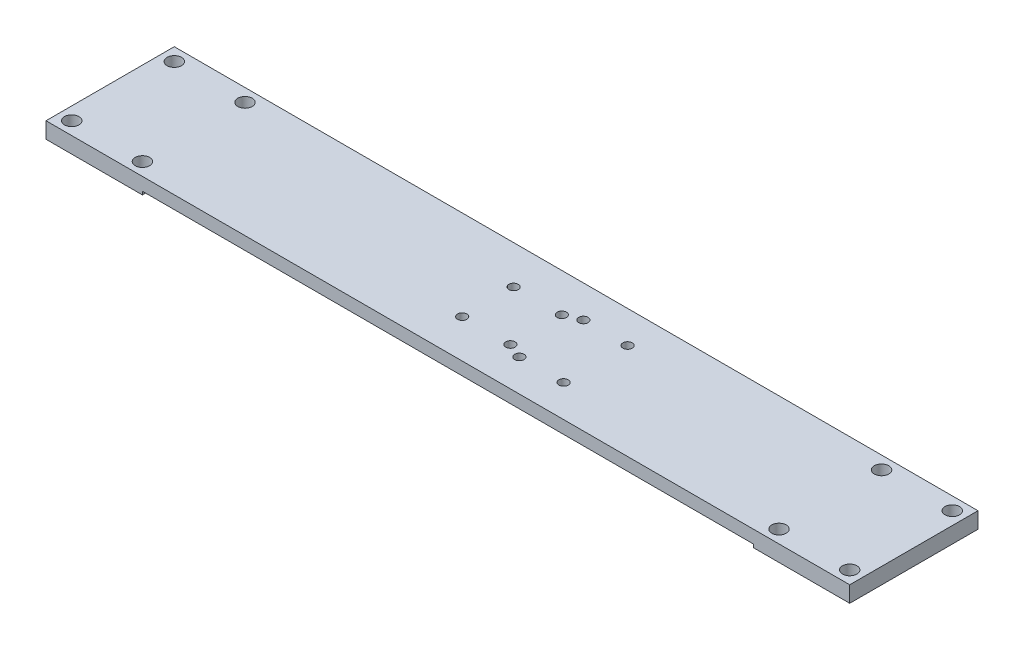
ISO-10303-21;
HEADER;
FILE_DESCRIPTION(('STEP AP214'),'2;1');
FILE_NAME('part.step','',(''),(''),'','','');
FILE_SCHEMA(('AUTOMOTIVE_DESIGN { 1 0 10303 214 1 1 1 1 }'));
ENDSEC;
DATA;
#1=APPLICATION_CONTEXT('core data for automotive mechanical design processes');
#2=APPLICATION_PROTOCOL_DEFINITION('international standard','automotive_design',2000,#1);
#3=PRODUCT_CONTEXT('',#1,'mechanical');
#4=PRODUCT('Part','Part','',(#3));
#5=PRODUCT_RELATED_PRODUCT_CATEGORY('part','',(#4));
#6=PRODUCT_DEFINITION_FORMATION('','',#4);
#7=PRODUCT_DEFINITION_CONTEXT('part definition',#1,'design');
#8=PRODUCT_DEFINITION('design','',#6,#7);
#9=PRODUCT_DEFINITION_SHAPE('','',#8);
#10=(LENGTH_UNIT() NAMED_UNIT(*) SI_UNIT(.MILLI.,.METRE.));
#11=(NAMED_UNIT(*) PLANE_ANGLE_UNIT() SI_UNIT($,.RADIAN.));
#12=(NAMED_UNIT(*) SI_UNIT($,.STERADIAN.) SOLID_ANGLE_UNIT());
#13=UNCERTAINTY_MEASURE_WITH_UNIT(LENGTH_MEASURE(1.E-05),#10,'distance_accuracy_value','');
#14=(GEOMETRIC_REPRESENTATION_CONTEXT(3) GLOBAL_UNCERTAINTY_ASSIGNED_CONTEXT((#13)) GLOBAL_UNIT_ASSIGNED_CONTEXT((#10,
#11,#12)) REPRESENTATION_CONTEXT('',''));
#15=CARTESIAN_POINT('',(0.,0.,0.));
#16=DIRECTION('',(0.,0.,1.));
#17=DIRECTION('',(1.,0.,0.));
#18=AXIS2_PLACEMENT_3D('',#15,#16,#17);
#19=CARTESIAN_POINT('',(0.,0.,0.));
#20=DIRECTION('',(0.,1.,0.));
#21=DIRECTION('',(0.,0.,1.));
#22=AXIS2_PLACEMENT_3D('',#19,#20,#21);
#23=PLANE('',#22);
#24=CARTESIAN_POINT('',(-112.750000000002,3.05311331771918E-13,-29.9000000000004));
#25=DIRECTION('',(0.,-1.,0.));
#26=DIRECTION('',(0.,0.,-1.));
#27=AXIS2_PLACEMENT_3D('',#24,#25,#26);
#28=CIRCLE('',#27,1.45000000000003);
#29=CARTESIAN_POINT('',(-112.750000000002,3.05311331771918E-13,-31.3500000000004));
#30=VERTEX_POINT('',#29);
#31=EDGE_CURVE('E198',#30,#30,#28,.T.);
#32=ORIENTED_EDGE('',*,*,#31,.F.);
#33=EDGE_LOOP('',(#32));
#34=FACE_BOUND('',#33,.T.);
#35=CARTESIAN_POINT('',(-99.0000000000022,3.05311331771918E-13,-10.0000000000008));
#36=DIRECTION('',(0.,-1.,0.));
#37=DIRECTION('',(0.,0.,-1.));
#38=AXIS2_PLACEMENT_3D('',#35,#36,#37);
#39=CIRCLE('',#38,1.45);
#40=CARTESIAN_POINT('',(-99.0000000000022,3.05311331771918E-13,-11.4500000000008));
#41=VERTEX_POINT('',#40);
#42=EDGE_CURVE('E197',#41,#41,#39,.T.);
#43=ORIENTED_EDGE('',*,*,#42,.F.);
#44=EDGE_LOOP('',(#43));
#45=FACE_BOUND('',#44,.T.);
#46=CARTESIAN_POINT('',(-99.0000000000021,3.05311331771918E-13,-29.9000000000003));
#47=DIRECTION('',(0.,-1.,0.));
#48=DIRECTION('',(0.,0.,-1.));
#49=AXIS2_PLACEMENT_3D('',#46,#47,#48);
#50=CIRCLE('',#49,1.45);
#51=CARTESIAN_POINT('',(-99.0000000000021,3.05311331771918E-13,-31.3500000000003));
#52=VERTEX_POINT('',#51);
#53=EDGE_CURVE('E194',#52,#52,#50,.T.);
#54=ORIENTED_EDGE('',*,*,#53,.F.);
#55=EDGE_LOOP('',(#54));
#56=FACE_BOUND('',#55,.T.);
#57=CARTESIAN_POINT('',(-112.750000000002,3.05311331771918E-13,-10.0000000000008));
#58=DIRECTION('',(0.,-1.,0.));
#59=DIRECTION('',(0.,0.,-1.));
#60=AXIS2_PLACEMENT_3D('',#57,#58,#59);
#61=CIRCLE('',#60,1.45);
#62=CARTESIAN_POINT('',(-112.750000000002,3.05311331771918E-13,-11.4500000000008));
#63=VERTEX_POINT('',#62);
#64=EDGE_CURVE('E201',#63,#63,#61,.T.);
#65=ORIENTED_EDGE('',*,*,#64,.F.);
#66=EDGE_LOOP('',(#65));
#67=FACE_BOUND('',#66,.T.);
#68=CARTESIAN_POINT('',(-132.5,0.,-11.95));
#69=DIRECTION('',(0.,1.,0.));
#70=DIRECTION('',(0.,0.,1.));
#71=AXIS2_PLACEMENT_3D('',#68,#69,#70);
#72=CIRCLE('',#71,1.45);
#73=CARTESIAN_POINT('',(-132.5,0.,-10.5));
#74=VERTEX_POINT('',#73);
#75=EDGE_CURVE('E39',#74,#74,#72,.T.);
#76=ORIENTED_EDGE('',*,*,#75,.T.);
#77=EDGE_LOOP('',(#76));
#78=FACE_BOUND('',#77,.T.);
#79=CARTESIAN_POINT('',(-117.5,0.,-11.95));
#80=DIRECTION('',(0.,1.,0.));
#81=DIRECTION('',(0.,0.,1.));
#82=AXIS2_PLACEMENT_3D('',#79,#80,#81);
#83=CIRCLE('',#82,1.45);
#84=CARTESIAN_POINT('',(-117.5,0.,-10.5));
#85=VERTEX_POINT('',#84);
#86=EDGE_CURVE('E246',#85,#85,#83,.T.);
#87=ORIENTED_EDGE('',*,*,#86,.T.);
#88=EDGE_LOOP('',(#87));
#89=FACE_BOUND('',#88,.T.);
#90=CARTESIAN_POINT('',(-117.5,0.,-27.95));
#91=DIRECTION('',(0.,1.,0.));
#92=DIRECTION('',(0.,0.,1.));
#93=AXIS2_PLACEMENT_3D('',#90,#91,#92);
#94=CIRCLE('',#93,1.45);
#95=CARTESIAN_POINT('',(-117.5,0.,-26.5));
#96=VERTEX_POINT('',#95);
#97=EDGE_CURVE('E244',#96,#96,#94,.T.);
#98=ORIENTED_EDGE('',*,*,#97,.T.);
#99=EDGE_LOOP('',(#98));
#100=FACE_BOUND('',#99,.T.);
#101=CARTESIAN_POINT('',(-132.5,0.,-27.95));
#102=DIRECTION('',(0.,1.,0.));
#103=DIRECTION('',(0.,0.,1.));
#104=AXIS2_PLACEMENT_3D('',#101,#102,#103);
#105=CIRCLE('',#104,1.45);
#106=CARTESIAN_POINT('',(-132.5,0.,-26.5));
#107=VERTEX_POINT('',#106);
#108=EDGE_CURVE('E230',#107,#107,#105,.T.);
#109=ORIENTED_EDGE('',*,*,#108,.T.);
#110=EDGE_LOOP('',(#109));
#111=FACE_BOUND('',#110,.T.);
#112=DIRECTION('',(0.,0.,-1.));
#113=VECTOR('',#112,1.);
#114=CARTESIAN_POINT('',(-30.,0.,0.));
#115=LINE('',#114,#113);
#116=CARTESIAN_POINT('',(-30.,0.,0.));
#117=VERTEX_POINT('',#116);
#118=CARTESIAN_POINT('',(-30.,0.,-39.9));
#119=VERTEX_POINT('',#118);
#120=EDGE_CURVE('E127',#117,#119,#115,.T.);
#121=ORIENTED_EDGE('',*,*,#120,.F.);
#122=DIRECTION('',(1.,0.,0.));
#123=VECTOR('',#122,1.);
#124=CARTESIAN_POINT('',(0.,0.,0.));
#125=LINE('',#124,#123);
#126=CARTESIAN_POINT('',(-220.,0.,0.));
#127=VERTEX_POINT('',#126);
#128=EDGE_CURVE('E233',#127,#117,#125,.T.);
#129=ORIENTED_EDGE('',*,*,#128,.F.);
#130=DIRECTION('',(0.,0.,1.));
#131=VECTOR('',#130,1.);
#132=CARTESIAN_POINT('',(-220.,0.,0.));
#133=LINE('',#132,#131);
#134=CARTESIAN_POINT('',(-220.,0.,-39.9));
#135=VERTEX_POINT('',#134);
#136=EDGE_CURVE('E151',#135,#127,#133,.T.);
#137=ORIENTED_EDGE('',*,*,#136,.F.);
#138=DIRECTION('',(-1.,0.,0.));
#139=VECTOR('',#138,1.);
#140=CARTESIAN_POINT('',(0.,0.,-39.9));
#141=LINE('',#140,#139);
#142=EDGE_CURVE('E52',#119,#135,#141,.T.);
#143=ORIENTED_EDGE('',*,*,#142,.F.);
#144=EDGE_LOOP('',(#121,#129,#137,#143));
#145=FACE_BOUND('',#144,.T.);
#146=ADVANCED_FACE('F35',(#34,#45,#56,#67,#78,#89,#100,#111,#145),#23,.F.);
#147=CARTESIAN_POINT('',(0.,4.,0.));
#148=DIRECTION('',(-1.,0.,0.));
#149=DIRECTION('',(0.,0.,1.));
#150=AXIS2_PLACEMENT_3D('',#147,#148,#149);
#151=PLANE('',#150);
#152=DIRECTION('',(0.,-1.,0.));
#153=VECTOR('',#152,1.);
#154=CARTESIAN_POINT('',(0.,4.,0.));
#155=LINE('',#154,#153);
#156=CARTESIAN_POINT('',(0.,4.,0.));
#157=VERTEX_POINT('',#156);
#158=CARTESIAN_POINT('',(0.,-1.,0.));
#159=VERTEX_POINT('',#158);
#160=EDGE_CURVE('E104',#157,#159,#155,.T.);
#161=ORIENTED_EDGE('',*,*,#160,.T.);
#162=DIRECTION('',(0.,0.,1.));
#163=VECTOR('',#162,1.);
#164=CARTESIAN_POINT('',(0.,-1.,0.));
#165=LINE('',#164,#163);
#166=CARTESIAN_POINT('',(0.,-1.,-39.9));
#167=VERTEX_POINT('',#166);
#168=EDGE_CURVE('E108',#167,#159,#165,.T.);
#169=ORIENTED_EDGE('',*,*,#168,.F.);
#170=DIRECTION('',(0.,-1.,0.));
#171=VECTOR('',#170,1.);
#172=CARTESIAN_POINT('',(0.,4.,-39.9));
#173=LINE('',#172,#171);
#174=CARTESIAN_POINT('',(0.,4.,-39.9));
#175=VERTEX_POINT('',#174);
#176=EDGE_CURVE('E11',#175,#167,#173,.T.);
#177=ORIENTED_EDGE('',*,*,#176,.F.);
#178=DIRECTION('',(0.,0.,-1.));
#179=VECTOR('',#178,1.);
#180=CARTESIAN_POINT('',(0.,4.,0.));
#181=LINE('',#180,#179);
#182=EDGE_CURVE('E109',#157,#175,#181,.T.);
#183=ORIENTED_EDGE('',*,*,#182,.F.);
#184=EDGE_LOOP('',(#161,#169,#177,#183));
#185=FACE_BOUND('',#184,.T.);
#186=ADVANCED_FACE('F37',(#185),#151,.F.);
#187=CARTESIAN_POINT('',(0.,4.,-39.9));
#188=DIRECTION('',(0.,0.,1.));
#189=DIRECTION('',(1.,0.,0.));
#190=AXIS2_PLACEMENT_3D('',#187,#188,#189);
#191=PLANE('',#190);
#192=ORIENTED_EDGE('',*,*,#176,.T.);
#193=DIRECTION('',(1.,0.,0.));
#194=VECTOR('',#193,1.);
#195=CARTESIAN_POINT('',(0.,-1.,-39.9));
#196=LINE('',#195,#194);
#197=CARTESIAN_POINT('',(-30.,-1.,-39.9));
#198=VERTEX_POINT('',#197);
#199=EDGE_CURVE('E126',#198,#167,#196,.T.);
#200=ORIENTED_EDGE('',*,*,#199,.F.);
#201=DIRECTION('',(0.,1.,0.));
#202=VECTOR('',#201,1.);
#203=CARTESIAN_POINT('',(-30.,-1.,-39.9));
#204=LINE('',#203,#202);
#205=EDGE_CURVE('E135',#198,#119,#204,.T.);
#206=ORIENTED_EDGE('',*,*,#205,.T.);
#207=ORIENTED_EDGE('',*,*,#142,.T.);
#208=DIRECTION('',(0.,1.,0.));
#209=VECTOR('',#208,1.);
#210=CARTESIAN_POINT('',(-220.,-1.,-39.9));
#211=LINE('',#210,#209);
#212=CARTESIAN_POINT('',(-220.,-1.,-39.9));
#213=VERTEX_POINT('',#212);
#214=EDGE_CURVE('E167',#213,#135,#211,.T.);
#215=ORIENTED_EDGE('',*,*,#214,.F.);
#216=DIRECTION('',(1.,0.,0.));
#217=VECTOR('',#216,1.);
#218=CARTESIAN_POINT('',(-250.,-1.,-39.9));
#219=LINE('',#218,#217);
#220=CARTESIAN_POINT('',(-250.,-1.,-39.9));
#221=VERTEX_POINT('',#220);
#222=EDGE_CURVE('E155',#221,#213,#219,.T.);
#223=ORIENTED_EDGE('',*,*,#222,.F.);
#224=DIRECTION('',(0.,-1.,0.));
#225=VECTOR('',#224,1.);
#226=CARTESIAN_POINT('',(-250.,4.,-39.9));
#227=LINE('',#226,#225);
#228=CARTESIAN_POINT('',(-250.,4.,-39.9));
#229=VERTEX_POINT('',#228);
#230=EDGE_CURVE('E44',#229,#221,#227,.T.);
#231=ORIENTED_EDGE('',*,*,#230,.F.);
#232=DIRECTION('',(-1.,0.,0.));
#233=VECTOR('',#232,1.);
#234=CARTESIAN_POINT('',(0.,4.,-39.9));
#235=LINE('',#234,#233);
#236=EDGE_CURVE('E232',#175,#229,#235,.T.);
#237=ORIENTED_EDGE('',*,*,#236,.F.);
#238=EDGE_LOOP('',(#192,#200,#206,#207,#215,#223,#231,#237));
#239=FACE_BOUND('',#238,.T.);
#240=ADVANCED_FACE('F277',(#239),#191,.F.);
#241=CARTESIAN_POINT('',(-250.,4.,0.));
#242=DIRECTION('',(1.,0.,0.));
#243=DIRECTION('',(0.,0.,-1.));
#244=AXIS2_PLACEMENT_3D('',#241,#242,#243);
#245=PLANE('',#244);
#246=ORIENTED_EDGE('',*,*,#230,.T.);
#247=DIRECTION('',(0.,0.,-1.));
#248=VECTOR('',#247,1.);
#249=CARTESIAN_POINT('',(-250.,-1.,0.));
#250=LINE('',#249,#248);
#251=CARTESIAN_POINT('',(-250.,-1.,0.));
#252=VERTEX_POINT('',#251);
#253=EDGE_CURVE('E152',#252,#221,#250,.T.);
#254=ORIENTED_EDGE('',*,*,#253,.F.);
#255=DIRECTION('',(0.,-1.,0.));
#256=VECTOR('',#255,1.);
#257=CARTESIAN_POINT('',(-250.,4.,0.));
#258=LINE('',#257,#256);
#259=CARTESIAN_POINT('',(-250.,4.,0.));
#260=VERTEX_POINT('',#259);
#261=EDGE_CURVE('E111',#260,#252,#258,.T.);
#262=ORIENTED_EDGE('',*,*,#261,.F.);
#263=DIRECTION('',(0.,0.,1.));
#264=VECTOR('',#263,1.);
#265=CARTESIAN_POINT('',(-250.,4.,0.));
#266=LINE('',#265,#264);
#267=EDGE_CURVE('E235',#229,#260,#266,.T.);
#268=ORIENTED_EDGE('',*,*,#267,.F.);
#269=EDGE_LOOP('',(#246,#254,#262,#268));
#270=FACE_BOUND('',#269,.T.);
#271=ADVANCED_FACE('F285',(#270),#245,.F.);
#272=CARTESIAN_POINT('',(0.,4.,0.));
#273=DIRECTION('',(0.,0.,-1.));
#274=DIRECTION('',(-1.,0.,0.));
#275=AXIS2_PLACEMENT_3D('',#272,#273,#274);
#276=PLANE('',#275);
#277=ORIENTED_EDGE('',*,*,#261,.T.);
#278=DIRECTION('',(-1.,0.,0.));
#279=VECTOR('',#278,1.);
#280=CARTESIAN_POINT('',(-250.,-1.,0.));
#281=LINE('',#280,#279);
#282=CARTESIAN_POINT('',(-220.,-1.,0.));
#283=VERTEX_POINT('',#282);
#284=EDGE_CURVE('E159',#283,#252,#281,.T.);
#285=ORIENTED_EDGE('',*,*,#284,.F.);
#286=DIRECTION('',(0.,1.,0.));
#287=VECTOR('',#286,1.);
#288=CARTESIAN_POINT('',(-220.,-1.,0.));
#289=LINE('',#288,#287);
#290=EDGE_CURVE('E162',#283,#127,#289,.T.);
#291=ORIENTED_EDGE('',*,*,#290,.T.);
#292=ORIENTED_EDGE('',*,*,#128,.T.);
#293=DIRECTION('',(0.,1.,0.));
#294=VECTOR('',#293,1.);
#295=CARTESIAN_POINT('',(-30.,-1.,0.));
#296=LINE('',#295,#294);
#297=CARTESIAN_POINT('',(-30.,-1.,0.));
#298=VERTEX_POINT('',#297);
#299=EDGE_CURVE('E117',#298,#117,#296,.T.);
#300=ORIENTED_EDGE('',*,*,#299,.F.);
#301=DIRECTION('',(-1.,0.,0.));
#302=VECTOR('',#301,1.);
#303=CARTESIAN_POINT('',(0.,-1.,0.));
#304=LINE('',#303,#302);
#305=EDGE_CURVE('E114',#159,#298,#304,.T.);
#306=ORIENTED_EDGE('',*,*,#305,.F.);
#307=ORIENTED_EDGE('',*,*,#160,.F.);
#308=DIRECTION('',(1.,0.,0.));
#309=VECTOR('',#308,1.);
#310=CARTESIAN_POINT('',(0.,4.,0.));
#311=LINE('',#310,#309);
#312=EDGE_CURVE('E60',#260,#157,#311,.T.);
#313=ORIENTED_EDGE('',*,*,#312,.F.);
#314=EDGE_LOOP('',(#277,#285,#291,#292,#300,#306,#307,#313));
#315=FACE_BOUND('',#314,.T.);
#316=ADVANCED_FACE('F115',(#315),#276,.F.);
#317=CARTESIAN_POINT('',(0.,4.,0.));
#318=DIRECTION('',(0.,1.,0.));
#319=DIRECTION('',(0.,0.,1.));
#320=AXIS2_PLACEMENT_3D('',#317,#318,#319);
#321=PLANE('',#320);
#322=CARTESIAN_POINT('',(-4.,4.,-3.99999999999998));
#323=DIRECTION('',(0.,1.,0.));
#324=DIRECTION('',(0.,0.,1.));
#325=AXIS2_PLACEMENT_3D('',#322,#323,#324);
#326=CIRCLE('',#325,2.25);
#327=CARTESIAN_POINT('',(-4.,4.,-1.74999999999998));
#328=VERTEX_POINT('',#327);
#329=EDGE_CURVE('E174',#328,#328,#326,.T.);
#330=ORIENTED_EDGE('',*,*,#329,.F.);
#331=EDGE_LOOP('',(#330));
#332=FACE_BOUND('',#331,.T.);
#333=CARTESIAN_POINT('',(-246.,4.,-4.00000000000005));
#334=DIRECTION('',(0.,1.,0.));
#335=DIRECTION('',(0.,0.,-1.));
#336=AXIS2_PLACEMENT_3D('',#333,#334,#335);
#337=CIRCLE('',#336,2.25000000000001);
#338=CARTESIAN_POINT('',(-246.,4.,-6.25000000000006));
#339=VERTEX_POINT('',#338);
#340=EDGE_CURVE('E180',#339,#339,#337,.T.);
#341=ORIENTED_EDGE('',*,*,#340,.F.);
#342=EDGE_LOOP('',(#341));
#343=FACE_BOUND('',#342,.T.);
#344=CARTESIAN_POINT('',(-224.,4.,-4.00000000000005));
#345=DIRECTION('',(0.,1.,0.));
#346=DIRECTION('',(0.,0.,-1.));
#347=AXIS2_PLACEMENT_3D('',#344,#345,#346);
#348=CIRCLE('',#347,2.25000000000001);
#349=CARTESIAN_POINT('',(-224.,4.,-6.25000000000006));
#350=VERTEX_POINT('',#349);
#351=EDGE_CURVE('E183',#350,#350,#348,.T.);
#352=ORIENTED_EDGE('',*,*,#351,.F.);
#353=EDGE_LOOP('',(#352));
#354=FACE_BOUND('',#353,.T.);
#355=CARTESIAN_POINT('',(-224.,4.,-35.8999999999999));
#356=DIRECTION('',(0.,1.,0.));
#357=DIRECTION('',(0.,0.,1.));
#358=AXIS2_PLACEMENT_3D('',#355,#356,#357);
#359=CIRCLE('',#358,2.25000000000001);
#360=CARTESIAN_POINT('',(-224.,4.,-33.6499999999999));
#361=VERTEX_POINT('',#360);
#362=EDGE_CURVE('E186',#361,#361,#359,.T.);
#363=ORIENTED_EDGE('',*,*,#362,.F.);
#364=EDGE_LOOP('',(#363));
#365=FACE_BOUND('',#364,.T.);
#366=CARTESIAN_POINT('',(-26.,4.,-3.99999999999998));
#367=DIRECTION('',(0.,1.,0.));
#368=DIRECTION('',(0.,0.,1.));
#369=AXIS2_PLACEMENT_3D('',#366,#367,#368);
#370=CIRCLE('',#369,2.25);
#371=CARTESIAN_POINT('',(-26.,4.,-1.74999999999998));
#372=VERTEX_POINT('',#371);
#373=EDGE_CURVE('E171',#372,#372,#370,.T.);
#374=ORIENTED_EDGE('',*,*,#373,.F.);
#375=EDGE_LOOP('',(#374));
#376=FACE_BOUND('',#375,.T.);
#377=CARTESIAN_POINT('',(-26.,4.,-35.9));
#378=DIRECTION('',(0.,1.,0.));
#379=DIRECTION('',(0.,0.,-1.));
#380=AXIS2_PLACEMENT_3D('',#377,#378,#379);
#381=CIRCLE('',#380,2.25);
#382=CARTESIAN_POINT('',(-26.,4.,-38.15));
#383=VERTEX_POINT('',#382);
#384=EDGE_CURVE('E175',#383,#383,#381,.T.);
#385=ORIENTED_EDGE('',*,*,#384,.F.);
#386=EDGE_LOOP('',(#385));
#387=FACE_BOUND('',#386,.T.);
#388=CARTESIAN_POINT('',(-4.,4.,-35.9));
#389=DIRECTION('',(0.,1.,0.));
#390=DIRECTION('',(0.,0.,-1.));
#391=AXIS2_PLACEMENT_3D('',#388,#389,#390);
#392=CIRCLE('',#391,2.25);
#393=CARTESIAN_POINT('',(-4.,4.,-38.15));
#394=VERTEX_POINT('',#393);
#395=EDGE_CURVE('E170',#394,#394,#392,.T.);
#396=ORIENTED_EDGE('',*,*,#395,.F.);
#397=EDGE_LOOP('',(#396));
#398=FACE_BOUND('',#397,.T.);
#399=CARTESIAN_POINT('',(-246.,4.,-35.8999999999999));
#400=DIRECTION('',(0.,1.,0.));
#401=DIRECTION('',(0.,0.,1.));
#402=AXIS2_PLACEMENT_3D('',#399,#400,#401);
#403=CIRCLE('',#402,2.25000000000001);
#404=CARTESIAN_POINT('',(-246.,4.,-33.6499999999999));
#405=VERTEX_POINT('',#404);
#406=EDGE_CURVE('E189',#405,#405,#403,.T.);
#407=ORIENTED_EDGE('',*,*,#406,.F.);
#408=EDGE_LOOP('',(#407));
#409=FACE_BOUND('',#408,.T.);
#410=CARTESIAN_POINT('',(-112.750000000002,4.,-29.9000000000004));
#411=DIRECTION('',(0.,1.,0.));
#412=DIRECTION('',(0.,0.,1.));
#413=AXIS2_PLACEMENT_3D('',#410,#411,#412);
#414=CIRCLE('',#413,1.45000000000003);
#415=CARTESIAN_POINT('',(-112.750000000002,4.,-28.4500000000003));
#416=VERTEX_POINT('',#415);
#417=EDGE_CURVE('E215',#416,#416,#414,.T.);
#418=ORIENTED_EDGE('',*,*,#417,.F.);
#419=EDGE_LOOP('',(#418));
#420=FACE_BOUND('',#419,.T.);
#421=CARTESIAN_POINT('',(-99.0000000000022,4.,-10.0000000000008));
#422=DIRECTION('',(0.,1.,0.));
#423=DIRECTION('',(0.,0.,1.));
#424=AXIS2_PLACEMENT_3D('',#421,#422,#423);
#425=CIRCLE('',#424,1.45);
#426=CARTESIAN_POINT('',(-99.0000000000022,4.,-8.55000000000076));
#427=VERTEX_POINT('',#426);
#428=EDGE_CURVE('E212',#427,#427,#425,.T.);
#429=ORIENTED_EDGE('',*,*,#428,.F.);
#430=EDGE_LOOP('',(#429));
#431=FACE_BOUND('',#430,.T.);
#432=CARTESIAN_POINT('',(-99.0000000000021,4.,-29.9000000000003));
#433=DIRECTION('',(0.,1.,0.));
#434=DIRECTION('',(0.,0.,1.));
#435=AXIS2_PLACEMENT_3D('',#432,#433,#434);
#436=CIRCLE('',#435,1.45);
#437=CARTESIAN_POINT('',(-99.0000000000021,4.,-28.4500000000003));
#438=VERTEX_POINT('',#437);
#439=EDGE_CURVE('E209',#438,#438,#436,.T.);
#440=ORIENTED_EDGE('',*,*,#439,.F.);
#441=EDGE_LOOP('',(#440));
#442=FACE_BOUND('',#441,.T.);
#443=CARTESIAN_POINT('',(-112.750000000002,4.,-10.0000000000008));
#444=DIRECTION('',(0.,1.,0.));
#445=DIRECTION('',(0.,0.,1.));
#446=AXIS2_PLACEMENT_3D('',#443,#444,#445);
#447=CIRCLE('',#446,1.45);
#448=CARTESIAN_POINT('',(-112.750000000002,4.,-8.55000000000078));
#449=VERTEX_POINT('',#448);
#450=EDGE_CURVE('E206',#449,#449,#447,.T.);
#451=ORIENTED_EDGE('',*,*,#450,.F.);
#452=EDGE_LOOP('',(#451));
#453=FACE_BOUND('',#452,.T.);
#454=CARTESIAN_POINT('',(-132.5,4.,-11.95));
#455=DIRECTION('',(0.,1.,0.));
#456=DIRECTION('',(0.,0.,1.));
#457=AXIS2_PLACEMENT_3D('',#454,#455,#456);
#458=CIRCLE('',#457,1.45);
#459=CARTESIAN_POINT('',(-132.5,4.,-10.5));
#460=VERTEX_POINT('',#459);
#461=EDGE_CURVE('E218',#460,#460,#458,.T.);
#462=ORIENTED_EDGE('',*,*,#461,.F.);
#463=EDGE_LOOP('',(#462));
#464=FACE_BOUND('',#463,.T.);
#465=CARTESIAN_POINT('',(-117.5,4.,-11.95));
#466=DIRECTION('',(0.,1.,0.));
#467=DIRECTION('',(0.,0.,1.));
#468=AXIS2_PLACEMENT_3D('',#465,#466,#467);
#469=CIRCLE('',#468,1.45);
#470=CARTESIAN_POINT('',(-117.5,4.,-10.5));
#471=VERTEX_POINT('',#470);
#472=EDGE_CURVE('E223',#471,#471,#469,.T.);
#473=ORIENTED_EDGE('',*,*,#472,.F.);
#474=EDGE_LOOP('',(#473));
#475=FACE_BOUND('',#474,.T.);
#476=CARTESIAN_POINT('',(-117.5,4.,-27.95));
#477=DIRECTION('',(0.,1.,0.));
#478=DIRECTION('',(0.,0.,1.));
#479=AXIS2_PLACEMENT_3D('',#476,#477,#478);
#480=CIRCLE('',#479,1.45);
#481=CARTESIAN_POINT('',(-117.5,4.,-26.5));
#482=VERTEX_POINT('',#481);
#483=EDGE_CURVE('E219',#482,#482,#480,.T.);
#484=ORIENTED_EDGE('',*,*,#483,.F.);
#485=EDGE_LOOP('',(#484));
#486=FACE_BOUND('',#485,.T.);
#487=CARTESIAN_POINT('',(-132.5,4.,-27.95));
#488=DIRECTION('',(0.,1.,0.));
#489=DIRECTION('',(0.,0.,1.));
#490=AXIS2_PLACEMENT_3D('',#487,#488,#489);
#491=CIRCLE('',#490,1.45);
#492=CARTESIAN_POINT('',(-132.5,4.,-26.5));
#493=VERTEX_POINT('',#492);
#494=EDGE_CURVE('E222',#493,#493,#491,.T.);
#495=ORIENTED_EDGE('',*,*,#494,.F.);
#496=EDGE_LOOP('',(#495));
#497=FACE_BOUND('',#496,.T.);
#498=ORIENTED_EDGE('',*,*,#182,.T.);
#499=ORIENTED_EDGE('',*,*,#236,.T.);
#500=ORIENTED_EDGE('',*,*,#267,.T.);
#501=ORIENTED_EDGE('',*,*,#312,.T.);
#502=EDGE_LOOP('',(#498,#499,#500,#501));
#503=FACE_BOUND('',#502,.T.);
#504=ADVANCED_FACE('F282',(#332,#343,#354,#365,#376,#387,#398,#409,#420,#431,#442,#453,#464,
#475,#486,#497,#503),#321,.T.);
#505=CARTESIAN_POINT('',(-132.5,-8.,-27.95));
#506=DIRECTION('',(0.,1.,0.));
#507=DIRECTION('',(0.,0.,1.));
#508=AXIS2_PLACEMENT_3D('',#505,#506,#507);
#509=CYLINDRICAL_SURFACE('',#508,1.45);
#510=ORIENTED_EDGE('',*,*,#494,.T.);
#511=EDGE_LOOP('',(#510));
#512=FACE_BOUND('',#511,.T.);
#513=ORIENTED_EDGE('',*,*,#108,.F.);
#514=EDGE_LOOP('',(#513));
#515=FACE_BOUND('',#514,.T.);
#516=ADVANCED_FACE('F295',(#512,#515),#509,.F.);
#517=CARTESIAN_POINT('',(-117.5,-8.,-27.95));
#518=DIRECTION('',(0.,1.,0.));
#519=DIRECTION('',(0.,0.,1.));
#520=AXIS2_PLACEMENT_3D('',#517,#518,#519);
#521=CYLINDRICAL_SURFACE('',#520,1.45);
#522=ORIENTED_EDGE('',*,*,#483,.T.);
#523=EDGE_LOOP('',(#522));
#524=FACE_BOUND('',#523,.T.);
#525=ORIENTED_EDGE('',*,*,#97,.F.);
#526=EDGE_LOOP('',(#525));
#527=FACE_BOUND('',#526,.T.);
#528=ADVANCED_FACE('F267',(#524,#527),#521,.F.);
#529=CARTESIAN_POINT('',(-117.5,-8.,-11.95));
#530=DIRECTION('',(0.,1.,0.));
#531=DIRECTION('',(0.,0.,1.));
#532=AXIS2_PLACEMENT_3D('',#529,#530,#531);
#533=CYLINDRICAL_SURFACE('',#532,1.45);
#534=ORIENTED_EDGE('',*,*,#472,.T.);
#535=EDGE_LOOP('',(#534));
#536=FACE_BOUND('',#535,.T.);
#537=ORIENTED_EDGE('',*,*,#86,.F.);
#538=EDGE_LOOP('',(#537));
#539=FACE_BOUND('',#538,.T.);
#540=ADVANCED_FACE('F257',(#536,#539),#533,.F.);
#541=CARTESIAN_POINT('',(-132.5,-8.,-11.95));
#542=DIRECTION('',(0.,1.,0.));
#543=DIRECTION('',(0.,0.,1.));
#544=AXIS2_PLACEMENT_3D('',#541,#542,#543);
#545=CYLINDRICAL_SURFACE('',#544,1.45);
#546=ORIENTED_EDGE('',*,*,#461,.T.);
#547=EDGE_LOOP('',(#546));
#548=FACE_BOUND('',#547,.T.);
#549=ORIENTED_EDGE('',*,*,#75,.F.);
#550=EDGE_LOOP('',(#549));
#551=FACE_BOUND('',#550,.T.);
#552=ADVANCED_FACE('F254',(#548,#551),#545,.F.);
#553=CARTESIAN_POINT('',(-112.750000000002,12.0000000000003,-10.0000000000008));
#554=DIRECTION('',(0.,-1.,0.));
#555=DIRECTION('',(0.,0.,-1.));
#556=AXIS2_PLACEMENT_3D('',#553,#554,#555);
#557=CYLINDRICAL_SURFACE('',#556,1.45);
#558=ORIENTED_EDGE('',*,*,#450,.T.);
#559=EDGE_LOOP('',(#558));
#560=FACE_BOUND('',#559,.T.);
#561=ORIENTED_EDGE('',*,*,#64,.T.);
#562=EDGE_LOOP('',(#561));
#563=FACE_BOUND('',#562,.T.);
#564=ADVANCED_FACE('F256',(#560,#563),#557,.F.);
#565=CARTESIAN_POINT('',(-99.0000000000021,12.0000000000003,-29.9000000000003));
#566=DIRECTION('',(0.,-1.,0.));
#567=DIRECTION('',(0.,0.,-1.));
#568=AXIS2_PLACEMENT_3D('',#565,#566,#567);
#569=CYLINDRICAL_SURFACE('',#568,1.45);
#570=ORIENTED_EDGE('',*,*,#439,.T.);
#571=EDGE_LOOP('',(#570));
#572=FACE_BOUND('',#571,.T.);
#573=ORIENTED_EDGE('',*,*,#53,.T.);
#574=EDGE_LOOP('',(#573));
#575=FACE_BOUND('',#574,.T.);
#576=ADVANCED_FACE('F264',(#572,#575),#569,.F.);
#577=CARTESIAN_POINT('',(-99.0000000000022,12.0000000000003,-10.0000000000008));
#578=DIRECTION('',(0.,-1.,0.));
#579=DIRECTION('',(0.,0.,-1.));
#580=AXIS2_PLACEMENT_3D('',#577,#578,#579);
#581=CYLINDRICAL_SURFACE('',#580,1.45);
#582=ORIENTED_EDGE('',*,*,#428,.T.);
#583=EDGE_LOOP('',(#582));
#584=FACE_BOUND('',#583,.T.);
#585=ORIENTED_EDGE('',*,*,#42,.T.);
#586=EDGE_LOOP('',(#585));
#587=FACE_BOUND('',#586,.T.);
#588=ADVANCED_FACE('F386',(#584,#587),#581,.F.);
#589=CARTESIAN_POINT('',(-112.750000000002,12.0000000000003,-29.9000000000004));
#590=DIRECTION('',(0.,-1.,0.));
#591=DIRECTION('',(0.,0.,-1.));
#592=AXIS2_PLACEMENT_3D('',#589,#590,#591);
#593=CYLINDRICAL_SURFACE('',#592,1.45000000000003);
#594=ORIENTED_EDGE('',*,*,#417,.T.);
#595=EDGE_LOOP('',(#594));
#596=FACE_BOUND('',#595,.T.);
#597=ORIENTED_EDGE('',*,*,#31,.T.);
#598=EDGE_LOOP('',(#597));
#599=FACE_BOUND('',#598,.T.);
#600=ADVANCED_FACE('F382',(#596,#599),#593,.F.);
#601=CARTESIAN_POINT('',(-246.,-16.,-35.8999999999999));
#602=DIRECTION('',(0.,1.,0.));
#603=DIRECTION('',(0.,0.,1.));
#604=AXIS2_PLACEMENT_3D('',#601,#602,#603);
#605=CYLINDRICAL_SURFACE('',#604,2.25000000000001);
#606=ORIENTED_EDGE('',*,*,#406,.T.);
#607=EDGE_LOOP('',(#606));
#608=FACE_BOUND('',#607,.T.);
#609=CARTESIAN_POINT('',(-246.,-1.,-35.8999999999999));
#610=DIRECTION('',(0.,-1.,0.));
#611=DIRECTION('',(0.,0.,-1.));
#612=AXIS2_PLACEMENT_3D('',#609,#610,#611);
#613=CIRCLE('',#612,2.25000000000001);
#614=CARTESIAN_POINT('',(-246.,-1.,-38.1499999999999));
#615=VERTEX_POINT('',#614);
#616=EDGE_CURVE('E145',#615,#615,#613,.T.);
#617=ORIENTED_EDGE('',*,*,#616,.T.);
#618=EDGE_LOOP('',(#617));
#619=FACE_BOUND('',#618,.T.);
#620=ADVANCED_FACE('F379',(#608,#619),#605,.F.);
#621=CARTESIAN_POINT('',(-4.,-16.,-35.9));
#622=DIRECTION('',(0.,1.,0.));
#623=DIRECTION('',(0.,0.,1.));
#624=AXIS2_PLACEMENT_3D('',#621,#622,#623);
#625=CYLINDRICAL_SURFACE('',#624,2.25);
#626=ORIENTED_EDGE('',*,*,#395,.T.);
#627=EDGE_LOOP('',(#626));
#628=FACE_BOUND('',#627,.T.);
#629=CARTESIAN_POINT('',(-4.,-1.,-35.9));
#630=DIRECTION('',(0.,-1.,0.));
#631=DIRECTION('',(0.,0.,-1.));
#632=AXIS2_PLACEMENT_3D('',#629,#630,#631);
#633=CIRCLE('',#632,2.25);
#634=CARTESIAN_POINT('',(-4.,-1.,-38.15));
#635=VERTEX_POINT('',#634);
#636=EDGE_CURVE('E129',#635,#635,#633,.T.);
#637=ORIENTED_EDGE('',*,*,#636,.T.);
#638=EDGE_LOOP('',(#637));
#639=FACE_BOUND('',#638,.T.);
#640=ADVANCED_FACE('F372',(#628,#639),#625,.F.);
#641=CARTESIAN_POINT('',(-26.,-16.,-35.9));
#642=DIRECTION('',(0.,1.,0.));
#643=DIRECTION('',(0.,0.,1.));
#644=AXIS2_PLACEMENT_3D('',#641,#642,#643);
#645=CYLINDRICAL_SURFACE('',#644,2.25);
#646=ORIENTED_EDGE('',*,*,#384,.T.);
#647=EDGE_LOOP('',(#646));
#648=FACE_BOUND('',#647,.T.);
#649=CARTESIAN_POINT('',(-26.,-1.,-35.9));
#650=DIRECTION('',(0.,-1.,0.));
#651=DIRECTION('',(0.,0.,-1.));
#652=AXIS2_PLACEMENT_3D('',#649,#650,#651);
#653=CIRCLE('',#652,2.25);
#654=CARTESIAN_POINT('',(-26.,-1.,-38.15));
#655=VERTEX_POINT('',#654);
#656=EDGE_CURVE('E592',#655,#655,#653,.T.);
#657=ORIENTED_EDGE('',*,*,#656,.T.);
#658=EDGE_LOOP('',(#657));
#659=FACE_BOUND('',#658,.T.);
#660=ADVANCED_FACE('F488',(#648,#659),#645,.F.);
#661=CARTESIAN_POINT('',(-26.,-16.,-3.99999999999998));
#662=DIRECTION('',(0.,1.,0.));
#663=DIRECTION('',(0.,0.,1.));
#664=AXIS2_PLACEMENT_3D('',#661,#662,#663);
#665=CYLINDRICAL_SURFACE('',#664,2.25);
#666=ORIENTED_EDGE('',*,*,#373,.T.);
#667=EDGE_LOOP('',(#666));
#668=FACE_BOUND('',#667,.T.);
#669=CARTESIAN_POINT('',(-26.,-1.,-3.99999999999998));
#670=DIRECTION('',(0.,-1.,0.));
#671=DIRECTION('',(0.,0.,-1.));
#672=AXIS2_PLACEMENT_3D('',#669,#670,#671);
#673=CIRCLE('',#672,2.25);
#674=CARTESIAN_POINT('',(-26.,-1.,-6.24999999999998));
#675=VERTEX_POINT('',#674);
#676=EDGE_CURVE('E587',#675,#675,#673,.T.);
#677=ORIENTED_EDGE('',*,*,#676,.T.);
#678=EDGE_LOOP('',(#677));
#679=FACE_BOUND('',#678,.T.);
#680=ADVANCED_FACE('F376',(#668,#679),#665,.F.);
#681=CARTESIAN_POINT('',(-224.,-16.,-35.8999999999999));
#682=DIRECTION('',(0.,1.,0.));
#683=DIRECTION('',(0.,0.,1.));
#684=AXIS2_PLACEMENT_3D('',#681,#682,#683);
#685=CYLINDRICAL_SURFACE('',#684,2.25000000000001);
#686=ORIENTED_EDGE('',*,*,#362,.T.);
#687=EDGE_LOOP('',(#686));
#688=FACE_BOUND('',#687,.T.);
#689=CARTESIAN_POINT('',(-224.,-1.,-35.8999999999999));
#690=DIRECTION('',(0.,-1.,0.));
#691=DIRECTION('',(0.,0.,-1.));
#692=AXIS2_PLACEMENT_3D('',#689,#690,#691);
#693=CIRCLE('',#692,2.25000000000001);
#694=CARTESIAN_POINT('',(-224.,-1.,-38.1499999999999));
#695=VERTEX_POINT('',#694);
#696=EDGE_CURVE('E148',#695,#695,#693,.T.);
#697=ORIENTED_EDGE('',*,*,#696,.T.);
#698=EDGE_LOOP('',(#697));
#699=FACE_BOUND('',#698,.T.);
#700=ADVANCED_FACE('F368',(#688,#699),#685,.F.);
#701=CARTESIAN_POINT('',(-224.,-16.,-4.00000000000005));
#702=DIRECTION('',(0.,1.,0.));
#703=DIRECTION('',(0.,0.,1.));
#704=AXIS2_PLACEMENT_3D('',#701,#702,#703);
#705=CYLINDRICAL_SURFACE('',#704,2.25000000000001);
#706=ORIENTED_EDGE('',*,*,#351,.T.);
#707=EDGE_LOOP('',(#706));
#708=FACE_BOUND('',#707,.T.);
#709=CARTESIAN_POINT('',(-224.,-1.,-4.00000000000005));
#710=DIRECTION('',(0.,-1.,0.));
#711=DIRECTION('',(0.,0.,-1.));
#712=AXIS2_PLACEMENT_3D('',#709,#710,#711);
#713=CIRCLE('',#712,2.25000000000001);
#714=CARTESIAN_POINT('',(-224.,-1.,-6.25000000000006));
#715=VERTEX_POINT('',#714);
#716=EDGE_CURVE('E142',#715,#715,#713,.T.);
#717=ORIENTED_EDGE('',*,*,#716,.T.);
#718=EDGE_LOOP('',(#717));
#719=FACE_BOUND('',#718,.T.);
#720=ADVANCED_FACE('F359',(#708,#719),#705,.F.);
#721=CARTESIAN_POINT('',(-246.,-16.,-4.00000000000005));
#722=DIRECTION('',(0.,1.,0.));
#723=DIRECTION('',(0.,0.,1.));
#724=AXIS2_PLACEMENT_3D('',#721,#722,#723);
#725=CYLINDRICAL_SURFACE('',#724,2.25000000000001);
#726=ORIENTED_EDGE('',*,*,#340,.T.);
#727=EDGE_LOOP('',(#726));
#728=FACE_BOUND('',#727,.T.);
#729=CARTESIAN_POINT('',(-246.,-1.,-4.00000000000005));
#730=DIRECTION('',(0.,-1.,0.));
#731=DIRECTION('',(0.,0.,-1.));
#732=AXIS2_PLACEMENT_3D('',#729,#730,#731);
#733=CIRCLE('',#732,2.25000000000001);
#734=CARTESIAN_POINT('',(-246.,-1.,-6.25000000000006));
#735=VERTEX_POINT('',#734);
#736=EDGE_CURVE('E139',#735,#735,#733,.T.);
#737=ORIENTED_EDGE('',*,*,#736,.T.);
#738=EDGE_LOOP('',(#737));
#739=FACE_BOUND('',#738,.T.);
#740=ADVANCED_FACE('F357',(#728,#739),#725,.F.);
#741=CARTESIAN_POINT('',(-4.,-16.,-3.99999999999998));
#742=DIRECTION('',(0.,1.,0.));
#743=DIRECTION('',(0.,0.,1.));
#744=AXIS2_PLACEMENT_3D('',#741,#742,#743);
#745=CYLINDRICAL_SURFACE('',#744,2.25);
#746=ORIENTED_EDGE('',*,*,#329,.T.);
#747=EDGE_LOOP('',(#746));
#748=FACE_BOUND('',#747,.T.);
#749=CARTESIAN_POINT('',(-4.,-1.,-3.99999999999998));
#750=DIRECTION('',(0.,-1.,0.));
#751=DIRECTION('',(0.,0.,-1.));
#752=AXIS2_PLACEMENT_3D('',#749,#750,#751);
#753=CIRCLE('',#752,2.25);
#754=CARTESIAN_POINT('',(-4.,-1.,-6.24999999999998));
#755=VERTEX_POINT('',#754);
#756=EDGE_CURVE('E589',#755,#755,#753,.T.);
#757=ORIENTED_EDGE('',*,*,#756,.T.);
#758=EDGE_LOOP('',(#757));
#759=FACE_BOUND('',#758,.T.);
#760=ADVANCED_FACE('F350',(#748,#759),#745,.F.);
#761=CARTESIAN_POINT('',(0.,-1.,0.));
#762=DIRECTION('',(0.,-1.,0.));
#763=DIRECTION('',(0.,0.,-1.));
#764=AXIS2_PLACEMENT_3D('',#761,#762,#763);
#765=PLANE('',#764);
#766=ORIENTED_EDGE('',*,*,#716,.F.);
#767=EDGE_LOOP('',(#766));
#768=FACE_BOUND('',#767,.T.);
#769=ORIENTED_EDGE('',*,*,#696,.F.);
#770=EDGE_LOOP('',(#769));
#771=FACE_BOUND('',#770,.T.);
#772=ORIENTED_EDGE('',*,*,#253,.T.);
#773=ORIENTED_EDGE('',*,*,#222,.T.);
#774=DIRECTION('',(0.,0.,1.));
#775=VECTOR('',#774,1.);
#776=CARTESIAN_POINT('',(-220.,-1.,0.));
#777=LINE('',#776,#775);
#778=EDGE_CURVE('E157',#213,#283,#777,.T.);
#779=ORIENTED_EDGE('',*,*,#778,.T.);
#780=ORIENTED_EDGE('',*,*,#284,.T.);
#781=EDGE_LOOP('',(#772,#773,#779,#780));
#782=FACE_BOUND('',#781,.T.);
#783=ORIENTED_EDGE('',*,*,#616,.F.);
#784=EDGE_LOOP('',(#783));
#785=FACE_BOUND('',#784,.T.);
#786=ORIENTED_EDGE('',*,*,#736,.F.);
#787=EDGE_LOOP('',(#786));
#788=FACE_BOUND('',#787,.T.);
#789=ADVANCED_FACE('F346',(#768,#771,#782,#785,#788),#765,.T.);
#790=CARTESIAN_POINT('',(-220.,-1.,0.));
#791=DIRECTION('',(-1.,0.,0.));
#792=DIRECTION('',(0.,0.,1.));
#793=AXIS2_PLACEMENT_3D('',#790,#791,#792);
#794=PLANE('',#793);
#795=ORIENTED_EDGE('',*,*,#136,.T.);
#796=ORIENTED_EDGE('',*,*,#290,.F.);
#797=ORIENTED_EDGE('',*,*,#778,.F.);
#798=ORIENTED_EDGE('',*,*,#214,.T.);
#799=EDGE_LOOP('',(#795,#796,#797,#798));
#800=FACE_BOUND('',#799,.T.);
#801=ADVANCED_FACE('F343',(#800),#794,.F.);
#802=CARTESIAN_POINT('',(0.,-1.,0.));
#803=DIRECTION('',(0.,1.,0.));
#804=DIRECTION('',(0.,0.,1.));
#805=AXIS2_PLACEMENT_3D('',#802,#803,#804);
#806=PLANE('',#805);
#807=ORIENTED_EDGE('',*,*,#168,.T.);
#808=ORIENTED_EDGE('',*,*,#305,.T.);
#809=DIRECTION('',(0.,0.,-1.));
#810=VECTOR('',#809,1.);
#811=CARTESIAN_POINT('',(-30.,-1.,0.));
#812=LINE('',#811,#810);
#813=EDGE_CURVE('E120',#298,#198,#812,.T.);
#814=ORIENTED_EDGE('',*,*,#813,.T.);
#815=ORIENTED_EDGE('',*,*,#199,.T.);
#816=EDGE_LOOP('',(#807,#808,#814,#815));
#817=FACE_BOUND('',#816,.T.);
#818=ORIENTED_EDGE('',*,*,#636,.F.);
#819=EDGE_LOOP('',(#818));
#820=FACE_BOUND('',#819,.T.);
#821=ORIENTED_EDGE('',*,*,#656,.F.);
#822=EDGE_LOOP('',(#821));
#823=FACE_BOUND('',#822,.T.);
#824=ORIENTED_EDGE('',*,*,#756,.F.);
#825=EDGE_LOOP('',(#824));
#826=FACE_BOUND('',#825,.T.);
#827=ORIENTED_EDGE('',*,*,#676,.F.);
#828=EDGE_LOOP('',(#827));
#829=FACE_BOUND('',#828,.T.);
#830=ADVANCED_FACE('F123',(#817,#820,#823,#826,#829),#806,.F.);
#831=CARTESIAN_POINT('',(-30.,-1.,0.));
#832=DIRECTION('',(1.,0.,0.));
#833=DIRECTION('',(0.,0.,-1.));
#834=AXIS2_PLACEMENT_3D('',#831,#832,#833);
#835=PLANE('',#834);
#836=ORIENTED_EDGE('',*,*,#120,.T.);
#837=ORIENTED_EDGE('',*,*,#205,.F.);
#838=ORIENTED_EDGE('',*,*,#813,.F.);
#839=ORIENTED_EDGE('',*,*,#299,.T.);
#840=EDGE_LOOP('',(#836,#837,#838,#839));
#841=FACE_BOUND('',#840,.T.);
#842=ADVANCED_FACE('F556',(#841),#835,.F.);
#843=CLOSED_SHELL('',(#146,#186,#240,#271,#316,#504,#516,#528,#540,#552,#564,#576,#588,#600,
#620,#640,#660,#680,#700,#720,#740,#760,#789,#801,#830,#842));
#844=MANIFOLD_SOLID_BREP('B2',#843);
#845=ADVANCED_BREP_SHAPE_REPRESENTATION('',(#18,#844),#14);
#846=SHAPE_DEFINITION_REPRESENTATION(#9,#845);
ENDSEC;
END-ISO-10303-21;
